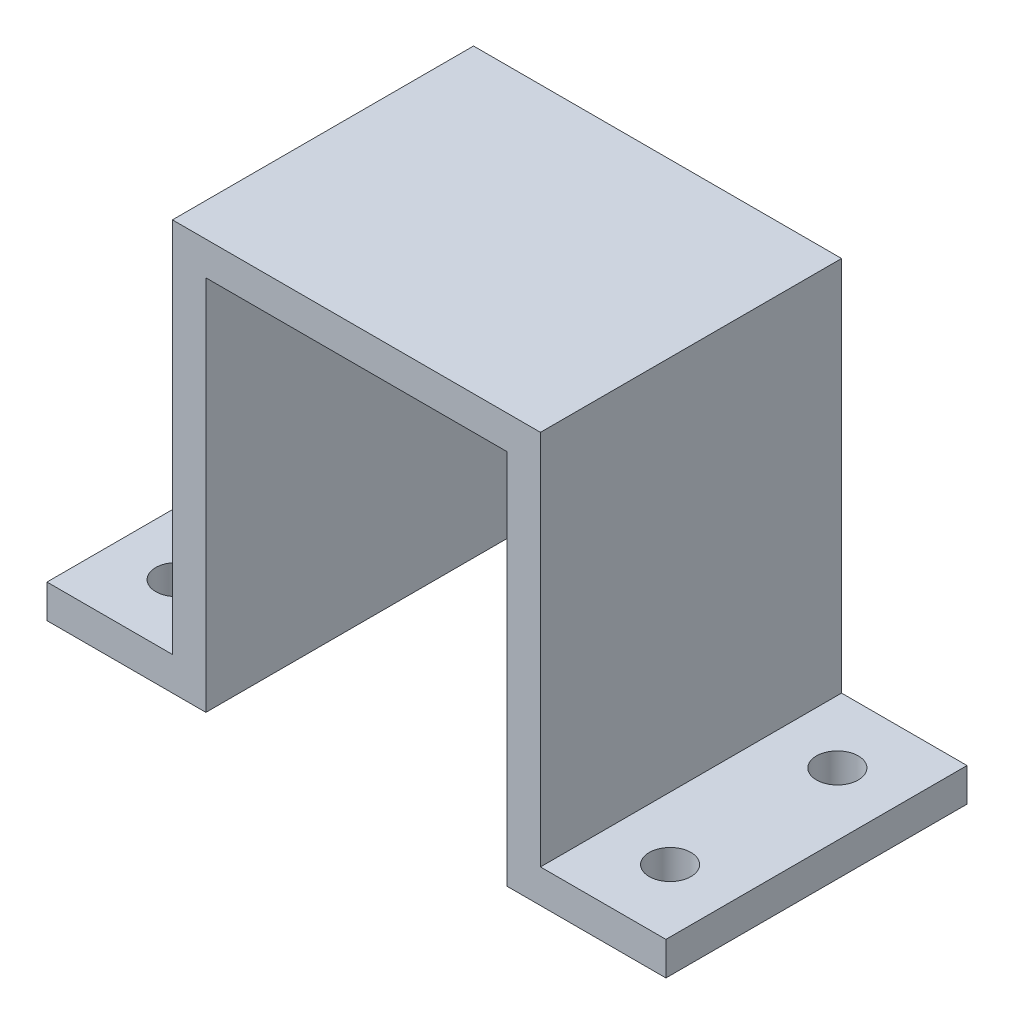
ISO-10303-21;
HEADER;
FILE_DESCRIPTION(('STEP AP214'),'2;1');
FILE_NAME('part.step','',(''),(''),'','','');
FILE_SCHEMA(('AUTOMOTIVE_DESIGN { 1 0 10303 214 1 1 1 1 }'));
ENDSEC;
DATA;
#1=APPLICATION_CONTEXT('core data for automotive mechanical design processes');
#2=APPLICATION_PROTOCOL_DEFINITION('international standard','automotive_design',2000,#1);
#3=PRODUCT_CONTEXT('',#1,'mechanical');
#4=PRODUCT('Part','Part','',(#3));
#5=PRODUCT_RELATED_PRODUCT_CATEGORY('part','',(#4));
#6=PRODUCT_DEFINITION_FORMATION('','',#4);
#7=PRODUCT_DEFINITION_CONTEXT('part definition',#1,'design');
#8=PRODUCT_DEFINITION('design','',#6,#7);
#9=PRODUCT_DEFINITION_SHAPE('','',#8);
#10=(LENGTH_UNIT() NAMED_UNIT(*) SI_UNIT(.MILLI.,.METRE.));
#11=(NAMED_UNIT(*) PLANE_ANGLE_UNIT() SI_UNIT($,.RADIAN.));
#12=(NAMED_UNIT(*) SI_UNIT($,.STERADIAN.) SOLID_ANGLE_UNIT());
#13=UNCERTAINTY_MEASURE_WITH_UNIT(LENGTH_MEASURE(1.E-05),#10,'distance_accuracy_value','');
#14=(GEOMETRIC_REPRESENTATION_CONTEXT(3) GLOBAL_UNCERTAINTY_ASSIGNED_CONTEXT((#13)) GLOBAL_UNIT_ASSIGNED_CONTEXT((#10,
#11,#12)) REPRESENTATION_CONTEXT('',''));
#15=CARTESIAN_POINT('',(0.,0.,0.));
#16=DIRECTION('',(0.,0.,1.));
#17=DIRECTION('',(1.,0.,0.));
#18=AXIS2_PLACEMENT_3D('',#15,#16,#17);
#19=CARTESIAN_POINT('',(40.,-49.,36.));
#20=DIRECTION('',(0.,1.,0.));
#21=DIRECTION('',(0.,0.,1.));
#22=AXIS2_PLACEMENT_3D('',#19,#20,#21);
#23=PLANE('',#22);
#24=DIRECTION('',(1.,0.,0.));
#25=VECTOR('',#24,1.);
#26=CARTESIAN_POINT('',(40.,-49.,0.));
#27=LINE('',#26,#25);
#28=CARTESIAN_POINT('',(36.,-49.,0.));
#29=VERTEX_POINT('',#28);
#30=CARTESIAN_POINT('',(55.,-49.,0.));
#31=VERTEX_POINT('',#30);
#32=EDGE_CURVE('E178',#29,#31,#27,.T.);
#33=ORIENTED_EDGE('',*,*,#32,.T.);
#34=DIRECTION('',(0.,0.,-1.));
#35=VECTOR('',#34,1.);
#36=CARTESIAN_POINT('',(55.,-49.,36.));
#37=LINE('',#36,#35);
#38=CARTESIAN_POINT('',(55.,-49.,36.));
#39=VERTEX_POINT('',#38);
#40=EDGE_CURVE('E149',#39,#31,#37,.T.);
#41=ORIENTED_EDGE('',*,*,#40,.F.);
#42=DIRECTION('',(1.,0.,0.));
#43=VECTOR('',#42,1.);
#44=CARTESIAN_POINT('',(36.,-49.,36.));
#45=LINE('',#44,#43);
#46=CARTESIAN_POINT('',(36.,-49.,36.));
#47=VERTEX_POINT('',#46);
#48=EDGE_CURVE('E140',#47,#39,#45,.T.);
#49=ORIENTED_EDGE('',*,*,#48,.F.);
#50=DIRECTION('',(0.,0.,-1.));
#51=VECTOR('',#50,1.);
#52=CARTESIAN_POINT('',(36.,-49.,36.));
#53=LINE('',#52,#51);
#54=EDGE_CURVE('E188',#47,#29,#53,.T.);
#55=ORIENTED_EDGE('',*,*,#54,.T.);
#56=EDGE_LOOP('',(#33,#41,#49,#55));
#57=FACE_BOUND('',#56,.T.);
#58=CARTESIAN_POINT('',(47.5,-49.,28.));
#59=DIRECTION('',(0.,1.,0.));
#60=DIRECTION('',(0.,0.,1.));
#61=AXIS2_PLACEMENT_3D('',#58,#59,#60);
#62=CIRCLE('',#61,2.5);
#63=CARTESIAN_POINT('',(47.5,-49.,30.5));
#64=VERTEX_POINT('',#63);
#65=EDGE_CURVE('E327',#64,#64,#62,.T.);
#66=ORIENTED_EDGE('',*,*,#65,.T.);
#67=EDGE_LOOP('',(#66));
#68=FACE_BOUND('',#67,.T.);
#69=CARTESIAN_POINT('',(47.5,-49.,7.99999999999999));
#70=DIRECTION('',(0.,1.,0.));
#71=DIRECTION('',(0.,0.,1.));
#72=AXIS2_PLACEMENT_3D('',#69,#70,#71);
#73=CIRCLE('',#72,2.5);
#74=CARTESIAN_POINT('',(47.5,-49.,10.5));
#75=VERTEX_POINT('',#74);
#76=EDGE_CURVE('E322',#75,#75,#73,.F.);
#77=ORIENTED_EDGE('',*,*,#76,.F.);
#78=EDGE_LOOP('',(#77));
#79=FACE_BOUND('',#78,.T.);
#80=ADVANCED_FACE('F37',(#57,#68,#79),#23,.F.);
#81=CARTESIAN_POINT('',(40.,-45.,36.));
#82=DIRECTION('',(0.,-1.,0.));
#83=DIRECTION('',(0.,0.,-1.));
#84=AXIS2_PLACEMENT_3D('',#81,#82,#83);
#85=PLANE('',#84);
#86=DIRECTION('',(-1.,0.,0.));
#87=VECTOR('',#86,1.);
#88=CARTESIAN_POINT('',(40.,-45.,0.));
#89=LINE('',#88,#87);
#90=CARTESIAN_POINT('',(55.,-45.,0.));
#91=VERTEX_POINT('',#90);
#92=CARTESIAN_POINT('',(40.,-45.,0.));
#93=VERTEX_POINT('',#92);
#94=EDGE_CURVE('E98',#91,#93,#89,.T.);
#95=ORIENTED_EDGE('',*,*,#94,.T.);
#96=DIRECTION('',(0.,0.,-1.));
#97=VECTOR('',#96,1.);
#98=CARTESIAN_POINT('',(40.,-45.,36.));
#99=LINE('',#98,#97);
#100=CARTESIAN_POINT('',(40.,-45.,36.));
#101=VERTEX_POINT('',#100);
#102=EDGE_CURVE('E150',#101,#93,#99,.T.);
#103=ORIENTED_EDGE('',*,*,#102,.F.);
#104=DIRECTION('',(-1.,0.,0.));
#105=VECTOR('',#104,1.);
#106=CARTESIAN_POINT('',(40.,-45.,36.));
#107=LINE('',#106,#105);
#108=CARTESIAN_POINT('',(55.,-45.,36.));
#109=VERTEX_POINT('',#108);
#110=EDGE_CURVE('E138',#109,#101,#107,.T.);
#111=ORIENTED_EDGE('',*,*,#110,.F.);
#112=DIRECTION('',(0.,0.,-1.));
#113=VECTOR('',#112,1.);
#114=CARTESIAN_POINT('',(55.,-45.,36.));
#115=LINE('',#114,#113);
#116=EDGE_CURVE('E145',#109,#91,#115,.T.);
#117=ORIENTED_EDGE('',*,*,#116,.T.);
#118=EDGE_LOOP('',(#95,#103,#111,#117));
#119=FACE_BOUND('',#118,.T.);
#120=CARTESIAN_POINT('',(47.5,-45.,28.));
#121=DIRECTION('',(0.,1.,0.));
#122=DIRECTION('',(0.,0.,1.));
#123=AXIS2_PLACEMENT_3D('',#120,#121,#122);
#124=CIRCLE('',#123,2.5);
#125=CARTESIAN_POINT('',(47.5,-45.,30.5));
#126=VERTEX_POINT('',#125);
#127=EDGE_CURVE('E324',#126,#126,#124,.T.);
#128=ORIENTED_EDGE('',*,*,#127,.F.);
#129=EDGE_LOOP('',(#128));
#130=FACE_BOUND('',#129,.T.);
#131=CARTESIAN_POINT('',(47.5,-45.,7.99999999999999));
#132=DIRECTION('',(0.,1.,0.));
#133=DIRECTION('',(0.,0.,1.));
#134=AXIS2_PLACEMENT_3D('',#131,#132,#133);
#135=CIRCLE('',#134,2.5);
#136=CARTESIAN_POINT('',(47.5,-45.,10.5));
#137=VERTEX_POINT('',#136);
#138=EDGE_CURVE('E319',#137,#137,#135,.F.);
#139=ORIENTED_EDGE('',*,*,#138,.T.);
#140=EDGE_LOOP('',(#139));
#141=FACE_BOUND('',#140,.T.);
#142=ADVANCED_FACE('F152',(#119,#130,#141),#85,.F.);
#143=CARTESIAN_POINT('',(-4.,-45.,36.));
#144=DIRECTION('',(0.,-1.,0.));
#145=DIRECTION('',(0.,0.,-1.));
#146=AXIS2_PLACEMENT_3D('',#143,#144,#145);
#147=PLANE('',#146);
#148=DIRECTION('',(-1.,0.,0.));
#149=VECTOR('',#148,1.);
#150=CARTESIAN_POINT('',(-4.,-45.,0.));
#151=LINE('',#150,#149);
#152=CARTESIAN_POINT('',(-4.,-45.,0.));
#153=VERTEX_POINT('',#152);
#154=CARTESIAN_POINT('',(-19.,-45.,0.));
#155=VERTEX_POINT('',#154);
#156=EDGE_CURVE('E163',#153,#155,#151,.T.);
#157=ORIENTED_EDGE('',*,*,#156,.T.);
#158=DIRECTION('',(0.,0.,-1.));
#159=VECTOR('',#158,1.);
#160=CARTESIAN_POINT('',(-19.,-45.,36.));
#161=LINE('',#160,#159);
#162=CARTESIAN_POINT('',(-19.,-45.,36.));
#163=VERTEX_POINT('',#162);
#164=EDGE_CURVE('E203',#163,#155,#161,.T.);
#165=ORIENTED_EDGE('',*,*,#164,.F.);
#166=DIRECTION('',(-1.,0.,0.));
#167=VECTOR('',#166,1.);
#168=CARTESIAN_POINT('',(-4.,-45.,36.));
#169=LINE('',#168,#167);
#170=CARTESIAN_POINT('',(-4.,-45.,36.));
#171=VERTEX_POINT('',#170);
#172=EDGE_CURVE('E223',#171,#163,#169,.T.);
#173=ORIENTED_EDGE('',*,*,#172,.F.);
#174=DIRECTION('',(0.,0.,-1.));
#175=VECTOR('',#174,1.);
#176=CARTESIAN_POINT('',(-4.,-45.,36.));
#177=LINE('',#176,#175);
#178=EDGE_CURVE('E47',#171,#153,#177,.T.);
#179=ORIENTED_EDGE('',*,*,#178,.T.);
#180=EDGE_LOOP('',(#157,#165,#173,#179));
#181=FACE_BOUND('',#180,.T.);
#182=CARTESIAN_POINT('',(-11.5,-45.,8.));
#183=DIRECTION('',(0.,1.,0.));
#184=DIRECTION('',(0.,0.,1.));
#185=AXIS2_PLACEMENT_3D('',#182,#183,#184);
#186=CIRCLE('',#185,2.5);
#187=CARTESIAN_POINT('',(-11.5,-45.,10.5));
#188=VERTEX_POINT('',#187);
#189=EDGE_CURVE('E208',#188,#188,#186,.T.);
#190=ORIENTED_EDGE('',*,*,#189,.F.);
#191=EDGE_LOOP('',(#190));
#192=FACE_BOUND('',#191,.T.);
#193=CARTESIAN_POINT('',(-11.5,-45.,28.));
#194=DIRECTION('',(0.,1.,0.));
#195=DIRECTION('',(0.,0.,1.));
#196=AXIS2_PLACEMENT_3D('',#193,#194,#195);
#197=CIRCLE('',#196,2.5);
#198=CARTESIAN_POINT('',(-11.5,-45.,30.5));
#199=VERTEX_POINT('',#198);
#200=EDGE_CURVE('E216',#199,#199,#197,.F.);
#201=ORIENTED_EDGE('',*,*,#200,.T.);
#202=EDGE_LOOP('',(#201));
#203=FACE_BOUND('',#202,.T.);
#204=ADVANCED_FACE('F257',(#181,#192,#203),#147,.F.);
#205=CARTESIAN_POINT('',(0.,-49.,36.));
#206=DIRECTION('',(0.,1.,0.));
#207=DIRECTION('',(0.,0.,1.));
#208=AXIS2_PLACEMENT_3D('',#205,#206,#207);
#209=PLANE('',#208);
#210=DIRECTION('',(1.,0.,0.));
#211=VECTOR('',#210,1.);
#212=CARTESIAN_POINT('',(0.,-49.,0.));
#213=LINE('',#212,#211);
#214=CARTESIAN_POINT('',(-19.,-49.,0.));
#215=VERTEX_POINT('',#214);
#216=CARTESIAN_POINT('',(0.,-49.,0.));
#217=VERTEX_POINT('',#216);
#218=EDGE_CURVE('E169',#215,#217,#213,.T.);
#219=ORIENTED_EDGE('',*,*,#218,.T.);
#220=DIRECTION('',(0.,0.,-1.));
#221=VECTOR('',#220,1.);
#222=CARTESIAN_POINT('',(0.,-49.,36.));
#223=LINE('',#222,#221);
#224=CARTESIAN_POINT('',(0.,-49.,36.));
#225=VERTEX_POINT('',#224);
#226=EDGE_CURVE('E197',#225,#217,#223,.T.);
#227=ORIENTED_EDGE('',*,*,#226,.F.);
#228=DIRECTION('',(1.,0.,0.));
#229=VECTOR('',#228,1.);
#230=CARTESIAN_POINT('',(-4.,-49.,36.));
#231=LINE('',#230,#229);
#232=CARTESIAN_POINT('',(-19.,-49.,36.));
#233=VERTEX_POINT('',#232);
#234=EDGE_CURVE('E227',#233,#225,#231,.T.);
#235=ORIENTED_EDGE('',*,*,#234,.F.);
#236=DIRECTION('',(0.,0.,-1.));
#237=VECTOR('',#236,1.);
#238=CARTESIAN_POINT('',(-19.,-49.,36.));
#239=LINE('',#238,#237);
#240=EDGE_CURVE('E200',#233,#215,#239,.T.);
#241=ORIENTED_EDGE('',*,*,#240,.T.);
#242=EDGE_LOOP('',(#219,#227,#235,#241));
#243=FACE_BOUND('',#242,.T.);
#244=CARTESIAN_POINT('',(-11.5,-49.,8.));
#245=DIRECTION('',(0.,1.,0.));
#246=DIRECTION('',(0.,0.,1.));
#247=AXIS2_PLACEMENT_3D('',#244,#245,#246);
#248=CIRCLE('',#247,2.5);
#249=CARTESIAN_POINT('',(-11.5,-49.,10.5));
#250=VERTEX_POINT('',#249);
#251=EDGE_CURVE('E164',#250,#250,#248,.T.);
#252=ORIENTED_EDGE('',*,*,#251,.T.);
#253=EDGE_LOOP('',(#252));
#254=FACE_BOUND('',#253,.T.);
#255=CARTESIAN_POINT('',(-11.5,-49.,28.));
#256=DIRECTION('',(0.,1.,0.));
#257=DIRECTION('',(0.,0.,1.));
#258=AXIS2_PLACEMENT_3D('',#255,#256,#257);
#259=CIRCLE('',#258,2.5);
#260=CARTESIAN_POINT('',(-11.5,-49.,30.5));
#261=VERTEX_POINT('',#260);
#262=EDGE_CURVE('E41',#261,#261,#259,.F.);
#263=ORIENTED_EDGE('',*,*,#262,.F.);
#264=EDGE_LOOP('',(#263));
#265=FACE_BOUND('',#264,.T.);
#266=ADVANCED_FACE('F265',(#243,#254,#265),#209,.F.);
#267=CARTESIAN_POINT('',(-4.,0.,36.));
#268=DIRECTION('',(1.,0.,0.));
#269=DIRECTION('',(0.,0.,-1.));
#270=AXIS2_PLACEMENT_3D('',#267,#268,#269);
#271=PLANE('',#270);
#272=DIRECTION('',(0.,-1.,0.));
#273=VECTOR('',#272,1.);
#274=CARTESIAN_POINT('',(-4.,0.,0.));
#275=LINE('',#274,#273);
#276=CARTESIAN_POINT('',(-4.,0.,0.));
#277=VERTEX_POINT('',#276);
#278=EDGE_CURVE('E161',#277,#153,#275,.T.);
#279=ORIENTED_EDGE('',*,*,#278,.T.);
#280=ORIENTED_EDGE('',*,*,#178,.F.);
#281=DIRECTION('',(0.,-1.,0.));
#282=VECTOR('',#281,1.);
#283=CARTESIAN_POINT('',(-4.,0.,36.));
#284=LINE('',#283,#282);
#285=CARTESIAN_POINT('',(-4.,0.,36.));
#286=VERTEX_POINT('',#285);
#287=EDGE_CURVE('E221',#286,#171,#284,.T.);
#288=ORIENTED_EDGE('',*,*,#287,.F.);
#289=DIRECTION('',(0.,0.,-1.));
#290=VECTOR('',#289,1.);
#291=CARTESIAN_POINT('',(-4.,0.,36.));
#292=LINE('',#291,#290);
#293=EDGE_CURVE('E11',#286,#277,#292,.T.);
#294=ORIENTED_EDGE('',*,*,#293,.T.);
#295=EDGE_LOOP('',(#279,#280,#288,#294));
#296=FACE_BOUND('',#295,.T.);
#297=ADVANCED_FACE('F39',(#296),#271,.F.);
#298=CARTESIAN_POINT('',(-19.,-49.,36.));
#299=DIRECTION('',(1.,0.,0.));
#300=DIRECTION('',(0.,0.,-1.));
#301=AXIS2_PLACEMENT_3D('',#298,#299,#300);
#302=PLANE('',#301);
#303=DIRECTION('',(0.,-1.,0.));
#304=VECTOR('',#303,1.);
#305=CARTESIAN_POINT('',(-19.,-49.,0.));
#306=LINE('',#305,#304);
#307=EDGE_CURVE('E166',#155,#215,#306,.T.);
#308=ORIENTED_EDGE('',*,*,#307,.T.);
#309=ORIENTED_EDGE('',*,*,#240,.F.);
#310=DIRECTION('',(0.,-1.,0.));
#311=VECTOR('',#310,1.);
#312=CARTESIAN_POINT('',(-19.,-49.,36.));
#313=LINE('',#312,#311);
#314=EDGE_CURVE('E225',#163,#233,#313,.T.);
#315=ORIENTED_EDGE('',*,*,#314,.F.);
#316=ORIENTED_EDGE('',*,*,#164,.T.);
#317=EDGE_LOOP('',(#308,#309,#315,#316));
#318=FACE_BOUND('',#317,.T.);
#319=ADVANCED_FACE('F261',(#318),#302,.F.);
#320=CARTESIAN_POINT('',(0.,-4.,36.));
#321=DIRECTION('',(-1.,0.,0.));
#322=DIRECTION('',(0.,-1.,0.));
#323=AXIS2_PLACEMENT_3D('',#320,#321,#322);
#324=PLANE('',#323);
#325=DIRECTION('',(0.,1.,0.));
#326=VECTOR('',#325,1.);
#327=CARTESIAN_POINT('',(0.,-4.,0.));
#328=LINE('',#327,#326);
#329=CARTESIAN_POINT('',(0.,-4.,0.));
#330=VERTEX_POINT('',#329);
#331=EDGE_CURVE('E171',#217,#330,#328,.T.);
#332=ORIENTED_EDGE('',*,*,#331,.T.);
#333=DIRECTION('',(0.,0.,-1.));
#334=VECTOR('',#333,1.);
#335=CARTESIAN_POINT('',(0.,-4.,36.));
#336=LINE('',#335,#334);
#337=CARTESIAN_POINT('',(0.,-4.,36.));
#338=VERTEX_POINT('',#337);
#339=EDGE_CURVE('E194',#338,#330,#336,.T.);
#340=ORIENTED_EDGE('',*,*,#339,.F.);
#341=DIRECTION('',(0.,1.,0.));
#342=VECTOR('',#341,1.);
#343=CARTESIAN_POINT('',(0.,-4.,36.));
#344=LINE('',#343,#342);
#345=EDGE_CURVE('E229',#225,#338,#344,.T.);
#346=ORIENTED_EDGE('',*,*,#345,.F.);
#347=ORIENTED_EDGE('',*,*,#226,.T.);
#348=EDGE_LOOP('',(#332,#340,#346,#347));
#349=FACE_BOUND('',#348,.T.);
#350=ADVANCED_FACE('F269',(#349),#324,.F.);
#351=CARTESIAN_POINT('',(0.,-4.,36.));
#352=DIRECTION('',(0.,1.,0.));
#353=DIRECTION('',(0.,0.,1.));
#354=AXIS2_PLACEMENT_3D('',#351,#352,#353);
#355=PLANE('',#354);
#356=DIRECTION('',(1.,0.,0.));
#357=VECTOR('',#356,1.);
#358=CARTESIAN_POINT('',(0.,-4.,0.));
#359=LINE('',#358,#357);
#360=CARTESIAN_POINT('',(36.,-4.,0.));
#361=VERTEX_POINT('',#360);
#362=EDGE_CURVE('E173',#330,#361,#359,.T.);
#363=ORIENTED_EDGE('',*,*,#362,.T.);
#364=DIRECTION('',(0.,0.,-1.));
#365=VECTOR('',#364,1.);
#366=CARTESIAN_POINT('',(36.,-4.,36.));
#367=LINE('',#366,#365);
#368=CARTESIAN_POINT('',(36.,-4.,36.));
#369=VERTEX_POINT('',#368);
#370=EDGE_CURVE('E191',#369,#361,#367,.T.);
#371=ORIENTED_EDGE('',*,*,#370,.F.);
#372=DIRECTION('',(1.,0.,0.));
#373=VECTOR('',#372,1.);
#374=CARTESIAN_POINT('',(0.,-4.,36.));
#375=LINE('',#374,#373);
#376=EDGE_CURVE('E231',#338,#369,#375,.T.);
#377=ORIENTED_EDGE('',*,*,#376,.F.);
#378=ORIENTED_EDGE('',*,*,#339,.T.);
#379=EDGE_LOOP('',(#363,#371,#377,#378));
#380=FACE_BOUND('',#379,.T.);
#381=ADVANCED_FACE('F273',(#380),#355,.F.);
#382=CARTESIAN_POINT('',(36.,-4.,36.));
#383=DIRECTION('',(1.,0.,0.));
#384=DIRECTION('',(0.,1.,0.));
#385=AXIS2_PLACEMENT_3D('',#382,#383,#384);
#386=PLANE('',#385);
#387=DIRECTION('',(0.,-1.,0.));
#388=VECTOR('',#387,1.);
#389=CARTESIAN_POINT('',(36.,-4.,0.));
#390=LINE('',#389,#388);
#391=EDGE_CURVE('E175',#361,#29,#390,.T.);
#392=ORIENTED_EDGE('',*,*,#391,.T.);
#393=ORIENTED_EDGE('',*,*,#54,.F.);
#394=DIRECTION('',(0.,-1.,0.));
#395=VECTOR('',#394,1.);
#396=CARTESIAN_POINT('',(36.,-4.,36.));
#397=LINE('',#396,#395);
#398=EDGE_CURVE('E233',#369,#47,#397,.T.);
#399=ORIENTED_EDGE('',*,*,#398,.F.);
#400=ORIENTED_EDGE('',*,*,#370,.T.);
#401=EDGE_LOOP('',(#392,#393,#399,#400));
#402=FACE_BOUND('',#401,.T.);
#403=ADVANCED_FACE('F239',(#402),#386,.F.);
#404=CARTESIAN_POINT('',(55.,-49.,36.));
#405=DIRECTION('',(-1.,0.,0.));
#406=DIRECTION('',(0.,0.,1.));
#407=AXIS2_PLACEMENT_3D('',#404,#405,#406);
#408=PLANE('',#407);
#409=DIRECTION('',(0.,1.,0.));
#410=VECTOR('',#409,1.);
#411=CARTESIAN_POINT('',(55.,-49.,0.));
#412=LINE('',#411,#410);
#413=EDGE_CURVE('E148',#31,#91,#412,.T.);
#414=ORIENTED_EDGE('',*,*,#413,.T.);
#415=ORIENTED_EDGE('',*,*,#116,.F.);
#416=DIRECTION('',(0.,1.,0.));
#417=VECTOR('',#416,1.);
#418=CARTESIAN_POINT('',(55.,-49.,36.));
#419=LINE('',#418,#417);
#420=EDGE_CURVE('E134',#39,#109,#419,.T.);
#421=ORIENTED_EDGE('',*,*,#420,.F.);
#422=ORIENTED_EDGE('',*,*,#40,.T.);
#423=EDGE_LOOP('',(#414,#415,#421,#422));
#424=FACE_BOUND('',#423,.T.);
#425=ADVANCED_FACE('F146',(#424),#408,.F.);
#426=CARTESIAN_POINT('',(40.,0.,36.));
#427=DIRECTION('',(-1.,0.,0.));
#428=DIRECTION('',(0.,0.,1.));
#429=AXIS2_PLACEMENT_3D('',#426,#427,#428);
#430=PLANE('',#429);
#431=DIRECTION('',(0.,1.,0.));
#432=VECTOR('',#431,1.);
#433=CARTESIAN_POINT('',(40.,0.,0.));
#434=LINE('',#433,#432);
#435=CARTESIAN_POINT('',(40.,0.,0.));
#436=VERTEX_POINT('',#435);
#437=EDGE_CURVE('E105',#93,#436,#434,.T.);
#438=ORIENTED_EDGE('',*,*,#437,.T.);
#439=DIRECTION('',(0.,0.,-1.));
#440=VECTOR('',#439,1.);
#441=CARTESIAN_POINT('',(40.,0.,36.));
#442=LINE('',#441,#440);
#443=CARTESIAN_POINT('',(40.,0.,36.));
#444=VERTEX_POINT('',#443);
#445=EDGE_CURVE('E157',#444,#436,#442,.T.);
#446=ORIENTED_EDGE('',*,*,#445,.F.);
#447=DIRECTION('',(0.,1.,0.));
#448=VECTOR('',#447,1.);
#449=CARTESIAN_POINT('',(40.,0.,36.));
#450=LINE('',#449,#448);
#451=EDGE_CURVE('E155',#101,#444,#450,.T.);
#452=ORIENTED_EDGE('',*,*,#451,.F.);
#453=ORIENTED_EDGE('',*,*,#102,.T.);
#454=EDGE_LOOP('',(#438,#446,#452,#453));
#455=FACE_BOUND('',#454,.T.);
#456=ADVANCED_FACE('F290',(#455),#430,.F.);
#457=CARTESIAN_POINT('',(36.,0.,36.));
#458=DIRECTION('',(0.,-1.,0.));
#459=DIRECTION('',(0.,0.,-1.));
#460=AXIS2_PLACEMENT_3D('',#457,#458,#459);
#461=PLANE('',#460);
#462=DIRECTION('',(-1.,0.,0.));
#463=VECTOR('',#462,1.);
#464=CARTESIAN_POINT('',(36.,0.,0.));
#465=LINE('',#464,#463);
#466=EDGE_CURVE('E183',#436,#277,#465,.T.);
#467=ORIENTED_EDGE('',*,*,#466,.T.);
#468=ORIENTED_EDGE('',*,*,#293,.F.);
#469=DIRECTION('',(-1.,0.,0.));
#470=VECTOR('',#469,1.);
#471=CARTESIAN_POINT('',(0.,0.,36.));
#472=LINE('',#471,#470);
#473=EDGE_CURVE('E56',#444,#286,#472,.T.);
#474=ORIENTED_EDGE('',*,*,#473,.F.);
#475=ORIENTED_EDGE('',*,*,#445,.T.);
#476=EDGE_LOOP('',(#467,#468,#474,#475));
#477=FACE_BOUND('',#476,.T.);
#478=ADVANCED_FACE('F248',(#477),#461,.F.);
#479=CARTESIAN_POINT('',(0.,0.,36.));
#480=DIRECTION('',(0.,0.,-1.));
#481=DIRECTION('',(-1.,0.,0.));
#482=AXIS2_PLACEMENT_3D('',#479,#480,#481);
#483=PLANE('',#482);
#484=ORIENTED_EDGE('',*,*,#473,.T.);
#485=ORIENTED_EDGE('',*,*,#287,.T.);
#486=ORIENTED_EDGE('',*,*,#172,.T.);
#487=ORIENTED_EDGE('',*,*,#314,.T.);
#488=ORIENTED_EDGE('',*,*,#234,.T.);
#489=ORIENTED_EDGE('',*,*,#345,.T.);
#490=ORIENTED_EDGE('',*,*,#376,.T.);
#491=ORIENTED_EDGE('',*,*,#398,.T.);
#492=ORIENTED_EDGE('',*,*,#48,.T.);
#493=ORIENTED_EDGE('',*,*,#420,.T.);
#494=ORIENTED_EDGE('',*,*,#110,.T.);
#495=ORIENTED_EDGE('',*,*,#451,.T.);
#496=EDGE_LOOP('',(#484,#485,#486,#487,#488,#489,#490,#491,#492,#493,#494,#495));
#497=FACE_BOUND('',#496,.T.);
#498=ADVANCED_FACE('F136',(#497),#483,.F.);
#499=CARTESIAN_POINT('',(0.,0.,0.));
#500=DIRECTION('',(0.,0.,-1.));
#501=DIRECTION('',(-1.,0.,0.));
#502=AXIS2_PLACEMENT_3D('',#499,#500,#501);
#503=PLANE('',#502);
#504=ORIENTED_EDGE('',*,*,#278,.F.);
#505=ORIENTED_EDGE('',*,*,#466,.F.);
#506=ORIENTED_EDGE('',*,*,#437,.F.);
#507=ORIENTED_EDGE('',*,*,#94,.F.);
#508=ORIENTED_EDGE('',*,*,#413,.F.);
#509=ORIENTED_EDGE('',*,*,#32,.F.);
#510=ORIENTED_EDGE('',*,*,#391,.F.);
#511=ORIENTED_EDGE('',*,*,#362,.F.);
#512=ORIENTED_EDGE('',*,*,#331,.F.);
#513=ORIENTED_EDGE('',*,*,#218,.F.);
#514=ORIENTED_EDGE('',*,*,#307,.F.);
#515=ORIENTED_EDGE('',*,*,#156,.F.);
#516=EDGE_LOOP('',(#504,#505,#506,#507,#508,#509,#510,#511,#512,#513,#514,#515));
#517=FACE_BOUND('',#516,.T.);
#518=ADVANCED_FACE('F245',(#517),#503,.T.);
#519=CARTESIAN_POINT('',(-11.5,-81.,8.));
#520=DIRECTION('',(0.,1.,0.));
#521=DIRECTION('',(0.,0.,1.));
#522=AXIS2_PLACEMENT_3D('',#519,#520,#521);
#523=CYLINDRICAL_SURFACE('',#522,2.5);
#524=ORIENTED_EDGE('',*,*,#189,.T.);
#525=EDGE_LOOP('',(#524));
#526=FACE_BOUND('',#525,.T.);
#527=ORIENTED_EDGE('',*,*,#251,.F.);
#528=EDGE_LOOP('',(#527));
#529=FACE_BOUND('',#528,.T.);
#530=ADVANCED_FACE('F298',(#526,#529),#523,.F.);
#531=CARTESIAN_POINT('',(-11.5,-81.,28.));
#532=DIRECTION('',(0.,1.,0.));
#533=DIRECTION('',(0.,0.,1.));
#534=AXIS2_PLACEMENT_3D('',#531,#532,#533);
#535=CYLINDRICAL_SURFACE('',#534,2.5);
#536=ORIENTED_EDGE('',*,*,#200,.F.);
#537=EDGE_LOOP('',(#536));
#538=FACE_BOUND('',#537,.T.);
#539=ORIENTED_EDGE('',*,*,#262,.T.);
#540=EDGE_LOOP('',(#539));
#541=FACE_BOUND('',#540,.T.);
#542=ADVANCED_FACE('F303',(#538,#541),#535,.F.);
#543=CARTESIAN_POINT('',(47.5,-81.,28.));
#544=DIRECTION('',(0.,1.,0.));
#545=DIRECTION('',(0.,0.,1.));
#546=AXIS2_PLACEMENT_3D('',#543,#544,#545);
#547=CYLINDRICAL_SURFACE('',#546,2.5);
#548=ORIENTED_EDGE('',*,*,#127,.T.);
#549=EDGE_LOOP('',(#548));
#550=FACE_BOUND('',#549,.T.);
#551=ORIENTED_EDGE('',*,*,#65,.F.);
#552=EDGE_LOOP('',(#551));
#553=FACE_BOUND('',#552,.T.);
#554=ADVANCED_FACE('F306',(#550,#553),#547,.F.);
#555=CARTESIAN_POINT('',(47.5,-81.,7.99999999999999));
#556=DIRECTION('',(0.,1.,0.));
#557=DIRECTION('',(0.,0.,1.));
#558=AXIS2_PLACEMENT_3D('',#555,#556,#557);
#559=CYLINDRICAL_SURFACE('',#558,2.5);
#560=ORIENTED_EDGE('',*,*,#138,.F.);
#561=EDGE_LOOP('',(#560));
#562=FACE_BOUND('',#561,.T.);
#563=ORIENTED_EDGE('',*,*,#76,.T.);
#564=EDGE_LOOP('',(#563));
#565=FACE_BOUND('',#564,.T.);
#566=ADVANCED_FACE('F310',(#562,#565),#559,.F.);
#567=CLOSED_SHELL('',(#80,#142,#204,#266,#297,#319,#350,#381,#403,#425,#456,#478,#498,#518,#530,
#542,#554,#566));
#568=MANIFOLD_SOLID_BREP('B2',#567);
#569=ADVANCED_BREP_SHAPE_REPRESENTATION('',(#18,#568),#14);
#570=SHAPE_DEFINITION_REPRESENTATION(#9,#569);
ENDSEC;
END-ISO-10303-21;
